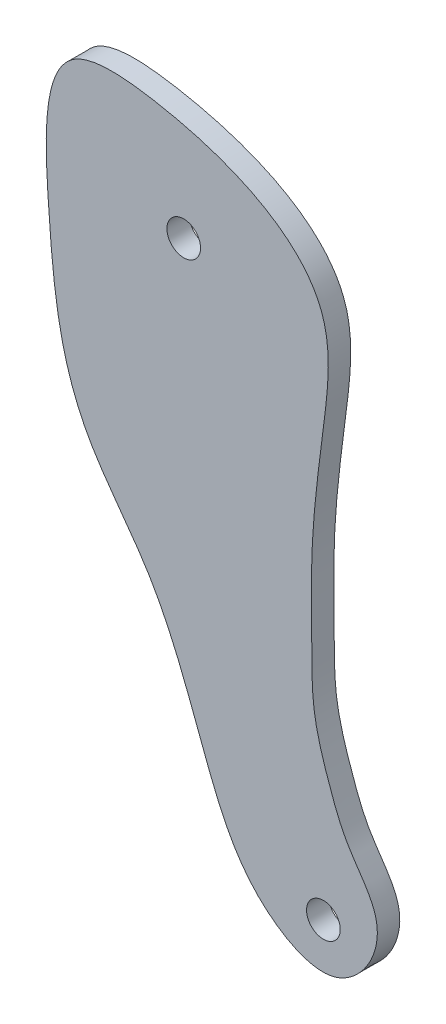
ISO-10303-21;
HEADER;
FILE_DESCRIPTION(('STEP AP214'),'2;1');
FILE_NAME('part.step','',(''),(''),'','','');
FILE_SCHEMA(('AUTOMOTIVE_DESIGN { 1 0 10303 214 1 1 1 1 }'));
ENDSEC;
DATA;
#1=APPLICATION_CONTEXT('core data for automotive mechanical design processes');
#2=APPLICATION_PROTOCOL_DEFINITION('international standard','automotive_design',2000,#1);
#3=PRODUCT_CONTEXT('',#1,'mechanical');
#4=PRODUCT('Part','Part','',(#3));
#5=PRODUCT_RELATED_PRODUCT_CATEGORY('part','',(#4));
#6=PRODUCT_DEFINITION_FORMATION('','',#4);
#7=PRODUCT_DEFINITION_CONTEXT('part definition',#1,'design');
#8=PRODUCT_DEFINITION('design','',#6,#7);
#9=PRODUCT_DEFINITION_SHAPE('','',#8);
#10=(LENGTH_UNIT() NAMED_UNIT(*) SI_UNIT(.MILLI.,.METRE.));
#11=(NAMED_UNIT(*) PLANE_ANGLE_UNIT() SI_UNIT($,.RADIAN.));
#12=(NAMED_UNIT(*) SI_UNIT($,.STERADIAN.) SOLID_ANGLE_UNIT());
#13=UNCERTAINTY_MEASURE_WITH_UNIT(LENGTH_MEASURE(1.E-05),#10,'distance_accuracy_value','');
#14=(GEOMETRIC_REPRESENTATION_CONTEXT(3) GLOBAL_UNCERTAINTY_ASSIGNED_CONTEXT((#13)) GLOBAL_UNIT_ASSIGNED_CONTEXT((#10,
#11,#12)) REPRESENTATION_CONTEXT('',''));
#15=CARTESIAN_POINT('',(0.,0.,0.));
#16=DIRECTION('',(0.,0.,1.));
#17=DIRECTION('',(1.,0.,0.));
#18=AXIS2_PLACEMENT_3D('',#15,#16,#17);
#19=CARTESIAN_POINT('',(135.730920913419,69.584677424622,5.82084216148825));
#20=DIRECTION('',(0.,0.,-1.));
#21=DIRECTION('',(-1.,0.,0.));
#22=AXIS2_PLACEMENT_3D('',#19,#20,#21);
#23=PLANE('',#22);
#24=CARTESIAN_POINT('',(128.811300115886,70.6951707923221,5.82084216148825));
#25=DIRECTION('',(0.,0.,1.));
#26=DIRECTION('',(1.,0.,0.));
#27=AXIS2_PLACEMENT_3D('',#24,#25,#26);
#28=CIRCLE('',#27,2.38125);
#29=CARTESIAN_POINT('',(131.192550115886,70.6951707923221,5.82084216148825));
#30=VERTEX_POINT('',#29);
#31=EDGE_CURVE('E84',#30,#30,#28,.T.);
#32=ORIENTED_EDGE('',*,*,#31,.F.);
#33=EDGE_LOOP('',(#32));
#34=FACE_BOUND('',#33,.T.);
#35=CARTESIAN_POINT('',(109.056978095884,144.290053505253,5.82084216148825));
#36=DIRECTION('',(0.,0.,1.));
#37=DIRECTION('',(1.,0.,0.));
#38=AXIS2_PLACEMENT_3D('',#35,#36,#37);
#39=CIRCLE('',#38,2.38125);
#40=CARTESIAN_POINT('',(111.438228095884,144.290053505253,5.82084216148825));
#41=VERTEX_POINT('',#40);
#42=EDGE_CURVE('E75',#41,#41,#39,.T.);
#43=ORIENTED_EDGE('',*,*,#42,.F.);
#44=EDGE_LOOP('',(#43));
#45=FACE_BOUND('',#44,.T.);
#46=CARTESIAN_POINT('',(93.7236120242112,158.575202565531,5.82084216148825));
#47=CARTESIAN_POINT('',(88.9525291691532,155.741302587246,5.82084216148825));
#48=CARTESIAN_POINT('',(89.975726735318,134.68433427203,5.82084216148825));
#49=CARTESIAN_POINT('',(92.0158146700969,115.849013171013,5.82084216148825));
#50=CARTESIAN_POINT('',(106.327973901364,99.3611806447824,5.82084216148825));
#51=CARTESIAN_POINT('',(111.577815007191,82.7509850346447,5.82084216148825));
#52=CARTESIAN_POINT('',(118.044811419536,68.2554390397237,5.82084216148825));
#53=CARTESIAN_POINT('',(129.632070629733,62.4672315231761,5.82084216148825));
#54=CARTESIAN_POINT('',(135.736049643487,68.100605472773,5.82084216148825));
#55=CARTESIAN_POINT('',(137.267718247554,75.3550773314951,5.82084216148825));
#56=CARTESIAN_POINT('',(132.185444716169,80.8028976663274,5.82084216148825));
#57=CARTESIAN_POINT('',(129.501178997715,87.9570503404901,5.82084216148825));
#58=CARTESIAN_POINT('',(127.048639787557,95.4576819051034,5.82084216148825));
#59=CARTESIAN_POINT('',(127.252385737326,104.559641983525,5.82084216148825));
#60=CARTESIAN_POINT('',(126.916794112402,116.561213438561,5.82084216148825));
#61=CARTESIAN_POINT('',(128.623303523834,129.484243747283,5.82084216148825));
#62=CARTESIAN_POINT('',(131.31068975564,150.537656973075,5.82084216148825));
#63=CARTESIAN_POINT('',(111.286242473898,159.000661077787,5.82084216148825));
#64=CARTESIAN_POINT('',(96.3419600668885,160.130433670649,5.82084216148825));
#65=CARTESIAN_POINT('',(93.7236120242112,158.575202565531,5.82084216148825));
#66=B_SPLINE_CURVE_WITH_KNOTS('',3,(#46,#47,#48,#49,#50,#51,#52,#53,#54,#55,#56,#57,#58,#59,#60,
#61,#62,#63,#64,#65),.UNSPECIFIED.,.T.,.F.,(4,1,1,1,1,1,1,1,1,1,1,1,1,1,1,1,1,4),(0.,
0.086473060650993,0.201223986008976,0.26384068095647,0.357440163050444,0.425309639594518,
0.467876456828416,0.496264858629833,0.519240724254788,0.556864445988728,0.583623929522762,
0.618875007961222,0.657601158798481,0.700502292565653,0.773446879731949,0.830648391421512,
0.952543987187349,1.),.UNSPECIFIED.);
#67=CARTESIAN_POINT('',(93.7236120242112,158.575202565531,5.82084216148825));
#68=VERTEX_POINT('',#67);
#69=EDGE_CURVE('E11',#68,#68,#66,.T.);
#70=ORIENTED_EDGE('',*,*,#69,.T.);
#71=EDGE_LOOP('',(#70));
#72=FACE_BOUND('',#71,.T.);
#73=ADVANCED_FACE('F57',(#34,#45,#72),#23,.F.);
#74=CARTESIAN_POINT('',(135.730920913419,69.584677424622,2.64584216148825));
#75=DIRECTION('',(0.,0.,-1.));
#76=DIRECTION('',(-1.,0.,0.));
#77=AXIS2_PLACEMENT_3D('',#74,#75,#76);
#78=PLANE('',#77);
#79=CARTESIAN_POINT('',(128.811300115886,70.6951707923221,2.64584216148825));
#80=DIRECTION('',(0.,0.,1.));
#81=DIRECTION('',(1.,0.,0.));
#82=AXIS2_PLACEMENT_3D('',#79,#80,#81);
#83=CIRCLE('',#82,2.38125);
#84=CARTESIAN_POINT('',(131.192550115886,70.6951707923221,2.64584216148825));
#85=VERTEX_POINT('',#84);
#86=EDGE_CURVE('E81',#85,#85,#83,.T.);
#87=ORIENTED_EDGE('',*,*,#86,.T.);
#88=EDGE_LOOP('',(#87));
#89=FACE_BOUND('',#88,.T.);
#90=CARTESIAN_POINT('',(109.056978095884,144.290053505253,2.64584216148825));
#91=DIRECTION('',(0.,0.,1.));
#92=DIRECTION('',(1.,0.,0.));
#93=AXIS2_PLACEMENT_3D('',#90,#91,#92);
#94=CIRCLE('',#93,2.38125);
#95=CARTESIAN_POINT('',(111.438228095884,144.290053505253,2.64584216148825));
#96=VERTEX_POINT('',#95);
#97=EDGE_CURVE('E70',#96,#96,#94,.T.);
#98=ORIENTED_EDGE('',*,*,#97,.T.);
#99=EDGE_LOOP('',(#98));
#100=FACE_BOUND('',#99,.T.);
#101=CARTESIAN_POINT('',(93.7236120242112,158.575202565531,2.64584216148825));
#102=CARTESIAN_POINT('',(88.9525291691532,155.741302587246,2.64584216148825));
#103=CARTESIAN_POINT('',(89.975726735318,134.68433427203,2.64584216148825));
#104=CARTESIAN_POINT('',(92.0158146700969,115.849013171013,2.64584216148825));
#105=CARTESIAN_POINT('',(106.327973901364,99.3611806447824,2.64584216148825));
#106=CARTESIAN_POINT('',(111.577815007191,82.7509850346447,2.64584216148825));
#107=CARTESIAN_POINT('',(118.044811419536,68.2554390397237,2.64584216148825));
#108=CARTESIAN_POINT('',(129.632070629733,62.4672315231761,2.64584216148825));
#109=CARTESIAN_POINT('',(135.736049643487,68.100605472773,2.64584216148825));
#110=CARTESIAN_POINT('',(137.267718247554,75.3550773314951,2.64584216148825));
#111=CARTESIAN_POINT('',(132.185444716169,80.8028976663274,2.64584216148825));
#112=CARTESIAN_POINT('',(129.501178997715,87.9570503404901,2.64584216148825));
#113=CARTESIAN_POINT('',(127.048639787557,95.4576819051034,2.64584216148825));
#114=CARTESIAN_POINT('',(127.252385737326,104.559641983525,2.64584216148825));
#115=CARTESIAN_POINT('',(126.916794112402,116.561213438561,2.64584216148825));
#116=CARTESIAN_POINT('',(128.623303523834,129.484243747283,2.64584216148825));
#117=CARTESIAN_POINT('',(131.31068975564,150.537656973075,2.64584216148825));
#118=CARTESIAN_POINT('',(111.286242473898,159.000661077787,2.64584216148825));
#119=CARTESIAN_POINT('',(96.3419600668885,160.130433670649,2.64584216148825));
#120=CARTESIAN_POINT('',(93.7236120242112,158.575202565531,2.64584216148825));
#121=B_SPLINE_CURVE_WITH_KNOTS('',3,(#101,#102,#103,#104,#105,#106,#107,#108,#109,#110,#111,
#112,#113,#114,#115,#116,#117,#118,#119,#120),.UNSPECIFIED.,.T.,.F.,(4,1,1,1,1,1,1,1,1,1,1,1,1,
1,1,1,1,4),(0.,0.086473060650993,0.201223986008976,0.26384068095647,0.357440163050444,
0.425309639594518,0.467876456828416,0.496264858629833,0.519240724254788,0.556864445988728,
0.583623929522762,0.618875007961222,0.657601158798481,0.700502292565653,0.773446879731949,
0.830648391421512,0.952543987187349,1.),.UNSPECIFIED.);
#122=CARTESIAN_POINT('',(93.7236120242112,158.575202565531,2.64584216148825));
#123=VERTEX_POINT('',#122);
#124=EDGE_CURVE('E62',#123,#123,#121,.T.);
#125=ORIENTED_EDGE('',*,*,#124,.F.);
#126=EDGE_LOOP('',(#125));
#127=FACE_BOUND('',#126,.T.);
#128=ADVANCED_FACE('F90',(#89,#100,#127),#78,.T.);
#129=DIRECTION('',(0.,0.,-1.));
#130=VECTOR('',#129,1.);
#131=SURFACE_OF_LINEAR_EXTRUSION('',#66,#130);
#132=ORIENTED_EDGE('',*,*,#69,.F.);
#133=EDGE_LOOP('',(#132));
#134=FACE_BOUND('',#133,.T.);
#135=ORIENTED_EDGE('',*,*,#124,.T.);
#136=EDGE_LOOP('',(#135));
#137=FACE_BOUND('',#136,.T.);
#138=ADVANCED_FACE('F59',(#134,#137),#131,.F.);
#139=CARTESIAN_POINT('',(109.056978095884,144.290053505253,2.64584216148825));
#140=DIRECTION('',(0.,0.,1.));
#141=DIRECTION('',(1.,0.,0.));
#142=AXIS2_PLACEMENT_3D('',#139,#140,#141);
#143=CYLINDRICAL_SURFACE('',#142,2.38125);
#144=ORIENTED_EDGE('',*,*,#97,.F.);
#145=EDGE_LOOP('',(#144));
#146=FACE_BOUND('',#145,.T.);
#147=ORIENTED_EDGE('',*,*,#42,.T.);
#148=EDGE_LOOP('',(#147));
#149=FACE_BOUND('',#148,.T.);
#150=ADVANCED_FACE('F96',(#146,#149),#143,.F.);
#151=CARTESIAN_POINT('',(128.811300115886,70.6951707923221,2.64584216148825));
#152=DIRECTION('',(0.,0.,1.));
#153=DIRECTION('',(1.,0.,0.));
#154=AXIS2_PLACEMENT_3D('',#151,#152,#153);
#155=CYLINDRICAL_SURFACE('',#154,2.38125);
#156=ORIENTED_EDGE('',*,*,#86,.F.);
#157=EDGE_LOOP('',(#156));
#158=FACE_BOUND('',#157,.T.);
#159=ORIENTED_EDGE('',*,*,#31,.T.);
#160=EDGE_LOOP('',(#159));
#161=FACE_BOUND('',#160,.T.);
#162=ADVANCED_FACE('F93',(#158,#161),#155,.F.);
#163=CLOSED_SHELL('',(#73,#128,#138,#150,#162));
#164=MANIFOLD_SOLID_BREP('B2',#163);
#165=ADVANCED_BREP_SHAPE_REPRESENTATION('',(#18,#164),#14);
#166=SHAPE_DEFINITION_REPRESENTATION(#9,#165);
ENDSEC;
END-ISO-10303-21;
